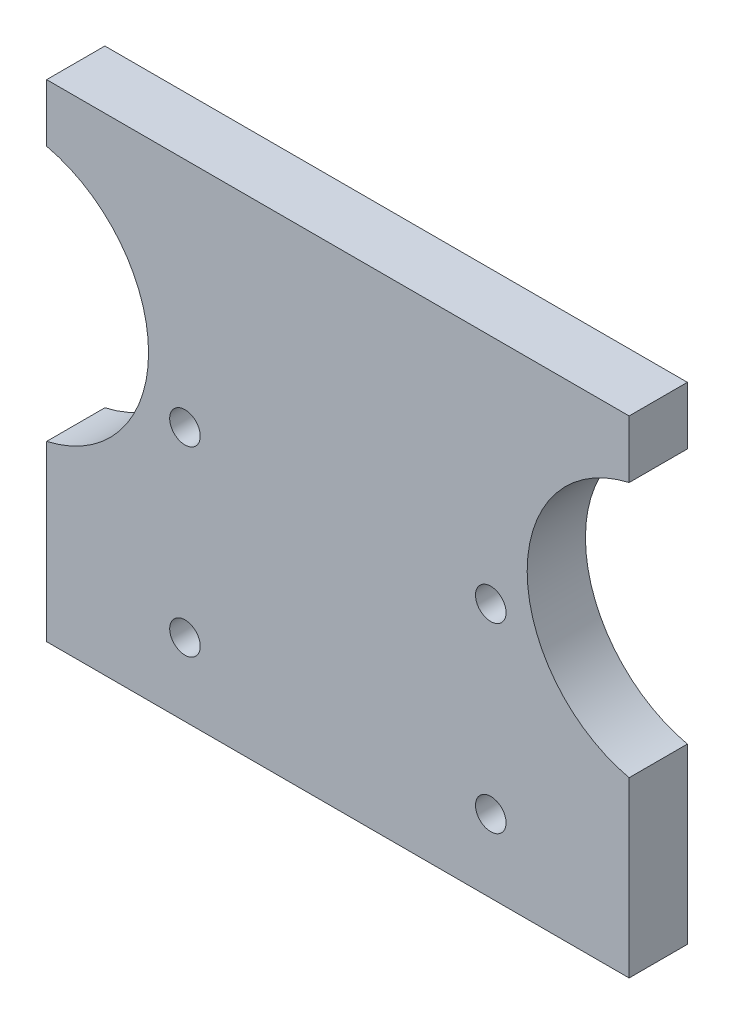
ISO-10303-21;
HEADER;
FILE_DESCRIPTION(('STEP AP214'),'2;1');
FILE_NAME('part.step','',(''),(''),'','','');
FILE_SCHEMA(('AUTOMOTIVE_DESIGN { 1 0 10303 214 1 1 1 1 }'));
ENDSEC;
DATA;
#1=APPLICATION_CONTEXT('core data for automotive mechanical design processes');
#2=APPLICATION_PROTOCOL_DEFINITION('international standard','automotive_design',2000,#1);
#3=PRODUCT_CONTEXT('',#1,'mechanical');
#4=PRODUCT('Part','Part','',(#3));
#5=PRODUCT_RELATED_PRODUCT_CATEGORY('part','',(#4));
#6=PRODUCT_DEFINITION_FORMATION('','',#4);
#7=PRODUCT_DEFINITION_CONTEXT('part definition',#1,'design');
#8=PRODUCT_DEFINITION('design','',#6,#7);
#9=PRODUCT_DEFINITION_SHAPE('','',#8);
#10=(LENGTH_UNIT() NAMED_UNIT(*) SI_UNIT(.MILLI.,.METRE.));
#11=(NAMED_UNIT(*) PLANE_ANGLE_UNIT() SI_UNIT($,.RADIAN.));
#12=(NAMED_UNIT(*) SI_UNIT($,.STERADIAN.) SOLID_ANGLE_UNIT());
#13=UNCERTAINTY_MEASURE_WITH_UNIT(LENGTH_MEASURE(1.E-05),#10,'distance_accuracy_value','');
#14=(GEOMETRIC_REPRESENTATION_CONTEXT(3) GLOBAL_UNCERTAINTY_ASSIGNED_CONTEXT((#13)) GLOBAL_UNIT_ASSIGNED_CONTEXT((#10,
#11,#12)) REPRESENTATION_CONTEXT('',''));
#15=CARTESIAN_POINT('',(0.,0.,0.));
#16=DIRECTION('',(0.,0.,1.));
#17=DIRECTION('',(1.,0.,0.));
#18=AXIS2_PLACEMENT_3D('',#15,#16,#17);
#19=CARTESIAN_POINT('',(-20.,18.4262101791949,4.));
#20=DIRECTION('',(1.,0.,0.));
#21=DIRECTION('',(0.,1.,0.));
#22=AXIS2_PLACEMENT_3D('',#19,#20,#21);
#23=PLANE('',#22);
#24=DIRECTION('',(0.,-1.,0.));
#25=VECTOR('',#24,1.);
#26=CARTESIAN_POINT('',(-20.,18.4262101791949,0.));
#27=LINE('',#26,#25);
#28=CARTESIAN_POINT('',(-20.,18.4262101791949,0.));
#29=VERTEX_POINT('',#28);
#30=CARTESIAN_POINT('',(-20.,14.4623926204246,0.));
#31=VERTEX_POINT('',#30);
#32=EDGE_CURVE('E109',#29,#31,#27,.T.);
#33=ORIENTED_EDGE('',*,*,#32,.T.);
#34=DIRECTION('',(0.,0.,1.));
#35=VECTOR('',#34,1.);
#36=CARTESIAN_POINT('',(-20.,14.4623926204246,-1.));
#37=LINE('',#36,#35);
#38=CARTESIAN_POINT('',(-20.,14.4623926204246,4.));
#39=VERTEX_POINT('',#38);
#40=EDGE_CURVE('E48',#31,#39,#37,.T.);
#41=ORIENTED_EDGE('',*,*,#40,.T.);
#42=DIRECTION('',(0.,-1.,0.));
#43=VECTOR('',#42,1.);
#44=CARTESIAN_POINT('',(-20.,18.4262101791949,4.));
#45=LINE('',#44,#43);
#46=CARTESIAN_POINT('',(-20.,18.4262101791949,4.));
#47=VERTEX_POINT('',#46);
#48=EDGE_CURVE('E107',#47,#39,#45,.T.);
#49=ORIENTED_EDGE('',*,*,#48,.F.);
#50=DIRECTION('',(0.,0.,-1.));
#51=VECTOR('',#50,1.);
#52=CARTESIAN_POINT('',(-20.,18.4262101791949,4.));
#53=LINE('',#52,#51);
#54=EDGE_CURVE('E141',#47,#29,#53,.T.);
#55=ORIENTED_EDGE('',*,*,#54,.T.);
#56=EDGE_LOOP('',(#33,#41,#49,#55));
#57=FACE_BOUND('',#56,.T.);
#58=ADVANCED_FACE('F33',(#57),#23,.F.);
#59=CARTESIAN_POINT('',(20.,18.4262101791949,4.));
#60=DIRECTION('',(-1.,0.,0.));
#61=DIRECTION('',(0.,-1.,0.));
#62=AXIS2_PLACEMENT_3D('',#59,#60,#61);
#63=PLANE('',#62);
#64=DIRECTION('',(0.,1.,0.));
#65=VECTOR('',#64,1.);
#66=CARTESIAN_POINT('',(20.,18.4262101791949,0.));
#67=LINE('',#66,#65);
#68=CARTESIAN_POINT('',(20.,-15.,0.));
#69=VERTEX_POINT('',#68);
#70=CARTESIAN_POINT('',(20.,-3.08753615435962,0.));
#71=VERTEX_POINT('',#70);
#72=EDGE_CURVE('E125',#69,#71,#67,.T.);
#73=ORIENTED_EDGE('',*,*,#72,.T.);
#74=DIRECTION('',(0.,0.,1.));
#75=VECTOR('',#74,1.);
#76=CARTESIAN_POINT('',(20.,-3.08753615435962,-1.));
#77=LINE('',#76,#75);
#78=CARTESIAN_POINT('',(20.,-3.08753615435962,4.));
#79=VERTEX_POINT('',#78);
#80=EDGE_CURVE('E55',#71,#79,#77,.T.);
#81=ORIENTED_EDGE('',*,*,#80,.T.);
#82=DIRECTION('',(0.,1.,0.));
#83=VECTOR('',#82,1.);
#84=CARTESIAN_POINT('',(20.,18.4262101791949,4.));
#85=LINE('',#84,#83);
#86=CARTESIAN_POINT('',(20.,-15.,4.));
#87=VERTEX_POINT('',#86);
#88=EDGE_CURVE('E158',#87,#79,#85,.T.);
#89=ORIENTED_EDGE('',*,*,#88,.F.);
#90=DIRECTION('',(0.,0.,-1.));
#91=VECTOR('',#90,1.);
#92=CARTESIAN_POINT('',(20.,-15.,4.));
#93=LINE('',#92,#91);
#94=EDGE_CURVE('E120',#87,#69,#93,.T.);
#95=ORIENTED_EDGE('',*,*,#94,.T.);
#96=EDGE_LOOP('',(#73,#81,#89,#95));
#97=FACE_BOUND('',#96,.T.);
#98=ADVANCED_FACE('F154',(#97),#63,.F.);
#99=CARTESIAN_POINT('',(20.,14.4623926204246,4.));
#100=VERTEX_POINT('',#99);
#101=CARTESIAN_POINT('',(20.,18.4262101791949,4.));
#102=VERTEX_POINT('',#101);
#103=EDGE_CURVE('E135',#100,#102,#85,.T.);
#104=ORIENTED_EDGE('',*,*,#103,.F.);
#105=DIRECTION('',(0.,0.,1.));
#106=VECTOR('',#105,1.);
#107=CARTESIAN_POINT('',(20.,14.4623926204246,-1.));
#108=LINE('',#107,#106);
#109=CARTESIAN_POINT('',(20.,14.4623926204246,0.));
#110=VERTEX_POINT('',#109);
#111=EDGE_CURVE('E168',#100,#110,#108,.F.);
#112=ORIENTED_EDGE('',*,*,#111,.T.);
#113=CARTESIAN_POINT('',(20.,18.4262101791949,0.));
#114=VERTEX_POINT('',#113);
#115=EDGE_CURVE('E129',#110,#114,#67,.T.);
#116=ORIENTED_EDGE('',*,*,#115,.T.);
#117=DIRECTION('',(0.,0.,-1.));
#118=VECTOR('',#117,1.);
#119=CARTESIAN_POINT('',(20.,18.4262101791949,4.));
#120=LINE('',#119,#118);
#121=EDGE_CURVE('E143',#102,#114,#120,.T.);
#122=ORIENTED_EDGE('',*,*,#121,.F.);
#123=EDGE_LOOP('',(#104,#112,#116,#122));
#124=FACE_BOUND('',#123,.T.);
#125=ADVANCED_FACE('F35',(#124),#63,.F.);
#126=CARTESIAN_POINT('',(-20.,18.4262101791949,4.));
#127=DIRECTION('',(0.,-1.,0.));
#128=DIRECTION('',(0.,0.,-1.));
#129=AXIS2_PLACEMENT_3D('',#126,#127,#128);
#130=PLANE('',#129);
#131=DIRECTION('',(-1.,0.,0.));
#132=VECTOR('',#131,1.);
#133=CARTESIAN_POINT('',(-20.,18.4262101791949,0.));
#134=LINE('',#133,#132);
#135=EDGE_CURVE('E128',#114,#29,#134,.T.);
#136=ORIENTED_EDGE('',*,*,#135,.T.);
#137=ORIENTED_EDGE('',*,*,#54,.F.);
#138=DIRECTION('',(-1.,0.,0.));
#139=VECTOR('',#138,1.);
#140=CARTESIAN_POINT('',(-20.,18.4262101791949,4.));
#141=LINE('',#140,#139);
#142=EDGE_CURVE('E115',#102,#47,#141,.T.);
#143=ORIENTED_EDGE('',*,*,#142,.F.);
#144=ORIENTED_EDGE('',*,*,#121,.T.);
#145=EDGE_LOOP('',(#136,#137,#143,#144));
#146=FACE_BOUND('',#145,.T.);
#147=ADVANCED_FACE('F199',(#146),#130,.F.);
#148=CARTESIAN_POINT('',(-20.,-3.08753615435961,4.));
#149=VERTEX_POINT('',#148);
#150=CARTESIAN_POINT('',(-20.,-15.,4.));
#151=VERTEX_POINT('',#150);
#152=EDGE_CURVE('E118',#149,#151,#45,.T.);
#153=ORIENTED_EDGE('',*,*,#152,.F.);
#154=DIRECTION('',(0.,0.,1.));
#155=VECTOR('',#154,1.);
#156=CARTESIAN_POINT('',(-20.,-3.08753615435961,-1.));
#157=LINE('',#156,#155);
#158=CARTESIAN_POINT('',(-20.,-3.08753615435961,0.));
#159=VERTEX_POINT('',#158);
#160=EDGE_CURVE('E98',#149,#159,#157,.F.);
#161=ORIENTED_EDGE('',*,*,#160,.T.);
#162=CARTESIAN_POINT('',(-20.,-15.,0.));
#163=VERTEX_POINT('',#162);
#164=EDGE_CURVE('E131',#159,#163,#27,.T.);
#165=ORIENTED_EDGE('',*,*,#164,.T.);
#166=DIRECTION('',(0.,0.,-1.));
#167=VECTOR('',#166,1.);
#168=CARTESIAN_POINT('',(-20.,-15.,4.));
#169=LINE('',#168,#167);
#170=EDGE_CURVE('E138',#151,#163,#169,.T.);
#171=ORIENTED_EDGE('',*,*,#170,.F.);
#172=EDGE_LOOP('',(#153,#161,#165,#171));
#173=FACE_BOUND('',#172,.T.);
#174=ADVANCED_FACE('F164',(#173),#23,.F.);
#175=CARTESIAN_POINT('',(-20.,-15.,4.));
#176=DIRECTION('',(0.,1.,0.));
#177=DIRECTION('',(0.,0.,1.));
#178=AXIS2_PLACEMENT_3D('',#175,#176,#177);
#179=PLANE('',#178);
#180=DIRECTION('',(1.,0.,0.));
#181=VECTOR('',#180,1.);
#182=CARTESIAN_POINT('',(-20.,-15.,0.));
#183=LINE('',#182,#181);
#184=EDGE_CURVE('E133',#163,#69,#183,.T.);
#185=ORIENTED_EDGE('',*,*,#184,.T.);
#186=ORIENTED_EDGE('',*,*,#94,.F.);
#187=DIRECTION('',(1.,0.,0.));
#188=VECTOR('',#187,1.);
#189=CARTESIAN_POINT('',(-20.,-15.,4.));
#190=LINE('',#189,#188);
#191=EDGE_CURVE('E117',#151,#87,#190,.T.);
#192=ORIENTED_EDGE('',*,*,#191,.F.);
#193=ORIENTED_EDGE('',*,*,#170,.T.);
#194=EDGE_LOOP('',(#185,#186,#192,#193));
#195=FACE_BOUND('',#194,.T.);
#196=ADVANCED_FACE('F161',(#195),#179,.F.);
#197=CARTESIAN_POINT('',(0.,0.,4.));
#198=DIRECTION('',(0.,0.,1.));
#199=DIRECTION('',(1.,0.,0.));
#200=AXIS2_PLACEMENT_3D('',#197,#198,#199);
#201=PLANE('',#200);
#202=CARTESIAN_POINT('',(-22.,5.68742823303251,4.));
#203=DIRECTION('',(0.,0.,1.));
#204=DIRECTION('',(1.,0.,0.));
#205=AXIS2_PLACEMENT_3D('',#202,#203,#204);
#206=CIRCLE('',#205,9.);
#207=EDGE_CURVE('E95',#149,#39,#206,.T.);
#208=ORIENTED_EDGE('',*,*,#207,.F.);
#209=ORIENTED_EDGE('',*,*,#152,.T.);
#210=ORIENTED_EDGE('',*,*,#191,.T.);
#211=ORIENTED_EDGE('',*,*,#88,.T.);
#212=CARTESIAN_POINT('',(22.,5.68742823303251,4.));
#213=DIRECTION('',(0.,0.,1.));
#214=DIRECTION('',(1.,0.,0.));
#215=AXIS2_PLACEMENT_3D('',#212,#213,#214);
#216=CIRCLE('',#215,9.);
#217=EDGE_CURVE('E110',#100,#79,#216,.T.);
#218=ORIENTED_EDGE('',*,*,#217,.F.);
#219=ORIENTED_EDGE('',*,*,#103,.T.);
#220=ORIENTED_EDGE('',*,*,#142,.T.);
#221=ORIENTED_EDGE('',*,*,#48,.T.);
#222=EDGE_LOOP('',(#208,#209,#210,#211,#218,#219,#220,#221));
#223=FACE_BOUND('',#222,.T.);
#224=CARTESIAN_POINT('',(-10.5,-10.,4.));
#225=DIRECTION('',(0.,0.,-1.));
#226=DIRECTION('',(-1.,0.,0.));
#227=AXIS2_PLACEMENT_3D('',#224,#225,#226);
#228=CIRCLE('',#227,1.05);
#229=CARTESIAN_POINT('',(-11.55,-10.,4.));
#230=VERTEX_POINT('',#229);
#231=EDGE_CURVE('E172',#230,#230,#228,.T.);
#232=ORIENTED_EDGE('',*,*,#231,.T.);
#233=EDGE_LOOP('',(#232));
#234=FACE_BOUND('',#233,.T.);
#235=CARTESIAN_POINT('',(10.5,-10.,4.));
#236=DIRECTION('',(0.,0.,-1.));
#237=DIRECTION('',(-1.,0.,0.));
#238=AXIS2_PLACEMENT_3D('',#235,#236,#237);
#239=CIRCLE('',#238,1.05);
#240=CARTESIAN_POINT('',(9.45,-10.,4.));
#241=VERTEX_POINT('',#240);
#242=EDGE_CURVE('E178',#241,#241,#239,.T.);
#243=ORIENTED_EDGE('',*,*,#242,.T.);
#244=EDGE_LOOP('',(#243));
#245=FACE_BOUND('',#244,.T.);
#246=CARTESIAN_POINT('',(-10.5,2.50000000000001,4.));
#247=DIRECTION('',(0.,0.,-1.));
#248=DIRECTION('',(-1.,0.,0.));
#249=AXIS2_PLACEMENT_3D('',#246,#247,#248);
#250=CIRCLE('',#249,1.05);
#251=CARTESIAN_POINT('',(-11.55,2.50000000000001,4.));
#252=VERTEX_POINT('',#251);
#253=EDGE_CURVE('E184',#252,#252,#250,.T.);
#254=ORIENTED_EDGE('',*,*,#253,.T.);
#255=EDGE_LOOP('',(#254));
#256=FACE_BOUND('',#255,.T.);
#257=CARTESIAN_POINT('',(10.5,2.50000000000001,4.));
#258=DIRECTION('',(0.,0.,-1.));
#259=DIRECTION('',(-1.,0.,0.));
#260=AXIS2_PLACEMENT_3D('',#257,#258,#259);
#261=CIRCLE('',#260,1.05);
#262=CARTESIAN_POINT('',(9.45,2.50000000000001,4.));
#263=VERTEX_POINT('',#262);
#264=EDGE_CURVE('E190',#263,#263,#261,.T.);
#265=ORIENTED_EDGE('',*,*,#264,.T.);
#266=EDGE_LOOP('',(#265));
#267=FACE_BOUND('',#266,.T.);
#268=ADVANCED_FACE('F112',(#223,#234,#245,#256,#267),#201,.T.);
#269=CARTESIAN_POINT('',(0.,0.,0.));
#270=DIRECTION('',(0.,0.,1.));
#271=DIRECTION('',(1.,0.,0.));
#272=AXIS2_PLACEMENT_3D('',#269,#270,#271);
#273=PLANE('',#272);
#274=CARTESIAN_POINT('',(-10.5,-10.,0.));
#275=DIRECTION('',(0.,0.,-1.));
#276=DIRECTION('',(-1.,0.,0.));
#277=AXIS2_PLACEMENT_3D('',#274,#275,#276);
#278=CIRCLE('',#277,1.05);
#279=CARTESIAN_POINT('',(-11.55,-10.,0.));
#280=VERTEX_POINT('',#279);
#281=EDGE_CURVE('E171',#280,#280,#278,.T.);
#282=ORIENTED_EDGE('',*,*,#281,.F.);
#283=EDGE_LOOP('',(#282));
#284=FACE_BOUND('',#283,.T.);
#285=CARTESIAN_POINT('',(10.5,-10.,0.));
#286=DIRECTION('',(0.,0.,-1.));
#287=DIRECTION('',(-1.,0.,0.));
#288=AXIS2_PLACEMENT_3D('',#285,#286,#287);
#289=CIRCLE('',#288,1.05);
#290=CARTESIAN_POINT('',(9.45,-10.,0.));
#291=VERTEX_POINT('',#290);
#292=EDGE_CURVE('E175',#291,#291,#289,.T.);
#293=ORIENTED_EDGE('',*,*,#292,.F.);
#294=EDGE_LOOP('',(#293));
#295=FACE_BOUND('',#294,.T.);
#296=CARTESIAN_POINT('',(-10.5,2.50000000000001,0.));
#297=DIRECTION('',(0.,0.,-1.));
#298=DIRECTION('',(-1.,0.,0.));
#299=AXIS2_PLACEMENT_3D('',#296,#297,#298);
#300=CIRCLE('',#299,1.05);
#301=CARTESIAN_POINT('',(-11.55,2.50000000000001,0.));
#302=VERTEX_POINT('',#301);
#303=EDGE_CURVE('E181',#302,#302,#300,.T.);
#304=ORIENTED_EDGE('',*,*,#303,.F.);
#305=EDGE_LOOP('',(#304));
#306=FACE_BOUND('',#305,.T.);
#307=CARTESIAN_POINT('',(10.5,2.50000000000001,0.));
#308=DIRECTION('',(0.,0.,-1.));
#309=DIRECTION('',(-1.,0.,0.));
#310=AXIS2_PLACEMENT_3D('',#307,#308,#309);
#311=CIRCLE('',#310,1.05);
#312=CARTESIAN_POINT('',(9.45,2.50000000000001,0.));
#313=VERTEX_POINT('',#312);
#314=EDGE_CURVE('E187',#313,#313,#311,.T.);
#315=ORIENTED_EDGE('',*,*,#314,.F.);
#316=EDGE_LOOP('',(#315));
#317=FACE_BOUND('',#316,.T.);
#318=ORIENTED_EDGE('',*,*,#164,.F.);
#319=CARTESIAN_POINT('',(-22.,5.68742823303251,0.));
#320=DIRECTION('',(0.,0.,1.));
#321=DIRECTION('',(1.,0.,0.));
#322=AXIS2_PLACEMENT_3D('',#319,#320,#321);
#323=CIRCLE('',#322,9.);
#324=EDGE_CURVE('E11',#159,#31,#323,.T.);
#325=ORIENTED_EDGE('',*,*,#324,.T.);
#326=ORIENTED_EDGE('',*,*,#32,.F.);
#327=ORIENTED_EDGE('',*,*,#135,.F.);
#328=ORIENTED_EDGE('',*,*,#115,.F.);
#329=CARTESIAN_POINT('',(22.,5.68742823303251,0.));
#330=DIRECTION('',(0.,0.,1.));
#331=DIRECTION('',(1.,0.,0.));
#332=AXIS2_PLACEMENT_3D('',#329,#330,#331);
#333=CIRCLE('',#332,9.);
#334=EDGE_CURVE('E41',#110,#71,#333,.T.);
#335=ORIENTED_EDGE('',*,*,#334,.T.);
#336=ORIENTED_EDGE('',*,*,#72,.F.);
#337=ORIENTED_EDGE('',*,*,#184,.F.);
#338=EDGE_LOOP('',(#318,#325,#326,#327,#328,#335,#336,#337));
#339=FACE_BOUND('',#338,.T.);
#340=ADVANCED_FACE('F149',(#284,#295,#306,#317,#339),#273,.F.);
#341=CARTESIAN_POINT('',(10.5,2.50000000000001,4.));
#342=DIRECTION('',(0.,0.,-1.));
#343=DIRECTION('',(-1.,0.,0.));
#344=AXIS2_PLACEMENT_3D('',#341,#342,#343);
#345=CYLINDRICAL_SURFACE('',#344,1.05);
#346=ORIENTED_EDGE('',*,*,#264,.F.);
#347=EDGE_LOOP('',(#346));
#348=FACE_BOUND('',#347,.T.);
#349=ORIENTED_EDGE('',*,*,#314,.T.);
#350=EDGE_LOOP('',(#349));
#351=FACE_BOUND('',#350,.T.);
#352=ADVANCED_FACE('F262',(#348,#351),#345,.F.);
#353=CARTESIAN_POINT('',(-10.5,2.50000000000001,4.));
#354=DIRECTION('',(0.,0.,-1.));
#355=DIRECTION('',(-1.,0.,0.));
#356=AXIS2_PLACEMENT_3D('',#353,#354,#355);
#357=CYLINDRICAL_SURFACE('',#356,1.05);
#358=ORIENTED_EDGE('',*,*,#253,.F.);
#359=EDGE_LOOP('',(#358));
#360=FACE_BOUND('',#359,.T.);
#361=ORIENTED_EDGE('',*,*,#303,.T.);
#362=EDGE_LOOP('',(#361));
#363=FACE_BOUND('',#362,.T.);
#364=ADVANCED_FACE('F252',(#360,#363),#357,.F.);
#365=CARTESIAN_POINT('',(10.5,-10.,4.));
#366=DIRECTION('',(0.,0.,-1.));
#367=DIRECTION('',(-1.,0.,0.));
#368=AXIS2_PLACEMENT_3D('',#365,#366,#367);
#369=CYLINDRICAL_SURFACE('',#368,1.05);
#370=ORIENTED_EDGE('',*,*,#242,.F.);
#371=EDGE_LOOP('',(#370));
#372=FACE_BOUND('',#371,.T.);
#373=ORIENTED_EDGE('',*,*,#292,.T.);
#374=EDGE_LOOP('',(#373));
#375=FACE_BOUND('',#374,.T.);
#376=ADVANCED_FACE('F209',(#372,#375),#369,.F.);
#377=CARTESIAN_POINT('',(-10.5,-10.,4.));
#378=DIRECTION('',(0.,0.,-1.));
#379=DIRECTION('',(-1.,0.,0.));
#380=AXIS2_PLACEMENT_3D('',#377,#378,#379);
#381=CYLINDRICAL_SURFACE('',#380,1.05);
#382=ORIENTED_EDGE('',*,*,#231,.F.);
#383=EDGE_LOOP('',(#382));
#384=FACE_BOUND('',#383,.T.);
#385=ORIENTED_EDGE('',*,*,#281,.T.);
#386=EDGE_LOOP('',(#385));
#387=FACE_BOUND('',#386,.T.);
#388=ADVANCED_FACE('F202',(#384,#387),#381,.F.);
#389=CARTESIAN_POINT('',(22.,5.68742823303251,-1.));
#390=DIRECTION('',(0.,0.,1.));
#391=DIRECTION('',(1.,0.,0.));
#392=AXIS2_PLACEMENT_3D('',#389,#390,#391);
#393=CYLINDRICAL_SURFACE('',#392,9.);
#394=ORIENTED_EDGE('',*,*,#334,.F.);
#395=ORIENTED_EDGE('',*,*,#111,.F.);
#396=ORIENTED_EDGE('',*,*,#217,.T.);
#397=ORIENTED_EDGE('',*,*,#80,.F.);
#398=EDGE_LOOP('',(#394,#395,#396,#397));
#399=FACE_BOUND('',#398,.T.);
#400=ADVANCED_FACE('F200',(#399),#393,.F.);
#401=CARTESIAN_POINT('',(-22.,5.68742823303251,-1.));
#402=DIRECTION('',(0.,0.,1.));
#403=DIRECTION('',(1.,0.,0.));
#404=AXIS2_PLACEMENT_3D('',#401,#402,#403);
#405=CYLINDRICAL_SURFACE('',#404,9.);
#406=ORIENTED_EDGE('',*,*,#324,.F.);
#407=ORIENTED_EDGE('',*,*,#160,.F.);
#408=ORIENTED_EDGE('',*,*,#207,.T.);
#409=ORIENTED_EDGE('',*,*,#40,.F.);
#410=EDGE_LOOP('',(#406,#407,#408,#409));
#411=FACE_BOUND('',#410,.T.);
#412=ADVANCED_FACE('F96',(#411),#405,.F.);
#413=CLOSED_SHELL('',(#58,#98,#125,#147,#174,#196,#268,#340,#352,#364,#376,#388,#400,#412));
#414=MANIFOLD_SOLID_BREP('B2',#413);
#415=ADVANCED_BREP_SHAPE_REPRESENTATION('',(#18,#414),#14);
#416=SHAPE_DEFINITION_REPRESENTATION(#9,#415);
ENDSEC;
END-ISO-10303-21;
